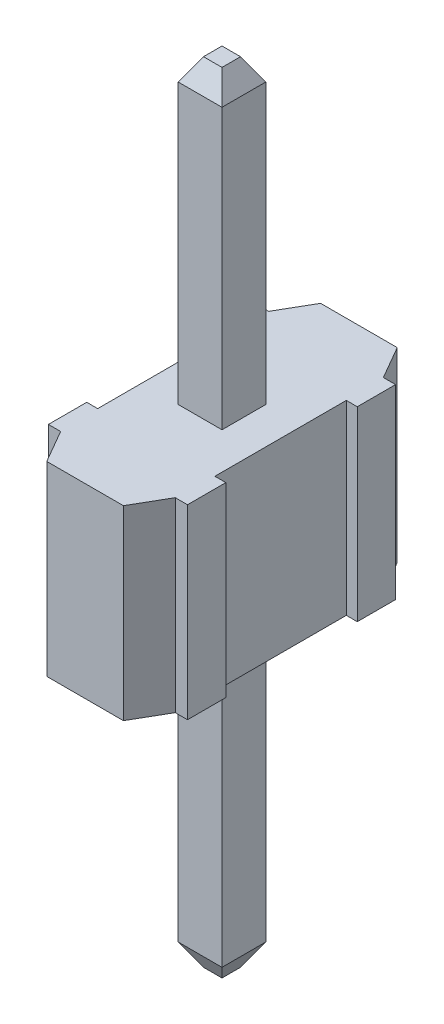
ISO-10303-21;
HEADER;
FILE_DESCRIPTION(('STEP AP214'),'2;1');
FILE_NAME('part.step','',(''),(''),'','','');
FILE_SCHEMA(('AUTOMOTIVE_DESIGN { 1 0 10303 214 1 1 1 1 }'));
ENDSEC;
DATA;
#1=APPLICATION_CONTEXT('core data for automotive mechanical design processes');
#2=APPLICATION_PROTOCOL_DEFINITION('international standard','automotive_design',2000,#1);
#3=PRODUCT_CONTEXT('',#1,'mechanical');
#4=PRODUCT('Part','Part','',(#3));
#5=PRODUCT_RELATED_PRODUCT_CATEGORY('part','',(#4));
#6=PRODUCT_DEFINITION_FORMATION('','',#4);
#7=PRODUCT_DEFINITION_CONTEXT('part definition',#1,'design');
#8=PRODUCT_DEFINITION('design','',#6,#7);
#9=PRODUCT_DEFINITION_SHAPE('','',#8);
#10=(LENGTH_UNIT() NAMED_UNIT(*) SI_UNIT(.MILLI.,.METRE.));
#11=(NAMED_UNIT(*) PLANE_ANGLE_UNIT() SI_UNIT($,.RADIAN.));
#12=(NAMED_UNIT(*) SI_UNIT($,.STERADIAN.) SOLID_ANGLE_UNIT());
#13=UNCERTAINTY_MEASURE_WITH_UNIT(LENGTH_MEASURE(1.E-05),#10,'distance_accuracy_value','');
#14=(GEOMETRIC_REPRESENTATION_CONTEXT(3) GLOBAL_UNCERTAINTY_ASSIGNED_CONTEXT((#13)) GLOBAL_UNIT_ASSIGNED_CONTEXT((#10,
#11,#12)) REPRESENTATION_CONTEXT('',''));
#15=CARTESIAN_POINT('',(0.,0.,0.));
#16=DIRECTION('',(0.,0.,1.));
#17=DIRECTION('',(1.,0.,0.));
#18=AXIS2_PLACEMENT_3D('',#15,#16,#17);
#19=CARTESIAN_POINT('',(0.,0.85,0.));
#20=DIRECTION('',(0.,-1.,0.));
#21=DIRECTION('',(0.,0.,-1.));
#22=AXIS2_PLACEMENT_3D('',#19,#20,#21);
#23=PLANE('',#22);
#24=DIRECTION('',(0.,0.,1.));
#25=VECTOR('',#24,1.);
#26=CARTESIAN_POINT('',(-0.635,0.85,0.95));
#27=LINE('',#26,#25);
#28=CARTESIAN_POINT('',(-0.635,0.85,0.6));
#29=VERTEX_POINT('',#28);
#30=CARTESIAN_POINT('',(-0.635,0.85,0.95));
#31=VERTEX_POINT('',#30);
#32=EDGE_CURVE('E282',#29,#31,#27,.T.);
#33=ORIENTED_EDGE('',*,*,#32,.T.);
#34=DIRECTION('',(1.,0.,0.));
#35=VECTOR('',#34,1.);
#36=CARTESIAN_POINT('',(-0.635,0.85,0.95));
#37=LINE('',#36,#35);
#38=CARTESIAN_POINT('',(-0.523205080756887,0.85,0.95));
#39=VERTEX_POINT('',#38);
#40=EDGE_CURVE('E285',#31,#39,#37,.T.);
#41=ORIENTED_EDGE('',*,*,#40,.T.);
#42=DIRECTION('',(0.499999999999998,0.,0.86602540378444));
#43=VECTOR('',#42,1.);
#44=CARTESIAN_POINT('',(-0.523205080756887,0.85,0.95));
#45=LINE('',#44,#43);
#46=CARTESIAN_POINT('',(-0.35,0.85,1.25));
#47=VERTEX_POINT('',#46);
#48=EDGE_CURVE('E288',#39,#47,#45,.T.);
#49=ORIENTED_EDGE('',*,*,#48,.T.);
#50=DIRECTION('',(1.,0.,0.));
#51=VECTOR('',#50,1.);
#52=CARTESIAN_POINT('',(-0.35,0.85,1.25));
#53=LINE('',#52,#51);
#54=CARTESIAN_POINT('',(0.35,0.85,1.25));
#55=VERTEX_POINT('',#54);
#56=EDGE_CURVE('E290',#47,#55,#53,.T.);
#57=ORIENTED_EDGE('',*,*,#56,.T.);
#58=DIRECTION('',(0.499999999999998,0.,-0.866025403784439));
#59=VECTOR('',#58,1.);
#60=CARTESIAN_POINT('',(0.523205080756887,0.85,0.95));
#61=LINE('',#60,#59);
#62=CARTESIAN_POINT('',(0.523205080756887,0.85,0.95));
#63=VERTEX_POINT('',#62);
#64=EDGE_CURVE('E292',#55,#63,#61,.T.);
#65=ORIENTED_EDGE('',*,*,#64,.T.);
#66=DIRECTION('',(1.,0.,0.));
#67=VECTOR('',#66,1.);
#68=CARTESIAN_POINT('',(0.635,0.85,0.95));
#69=LINE('',#68,#67);
#70=CARTESIAN_POINT('',(0.635,0.85,0.95));
#71=VERTEX_POINT('',#70);
#72=EDGE_CURVE('E294',#63,#71,#69,.T.);
#73=ORIENTED_EDGE('',*,*,#72,.T.);
#74=DIRECTION('',(0.,0.,-1.));
#75=VECTOR('',#74,1.);
#76=CARTESIAN_POINT('',(0.635,0.85,0.95));
#77=LINE('',#76,#75);
#78=CARTESIAN_POINT('',(0.635,0.85,0.6));
#79=VERTEX_POINT('',#78);
#80=EDGE_CURVE('E296',#71,#79,#77,.T.);
#81=ORIENTED_EDGE('',*,*,#80,.T.);
#82=DIRECTION('',(-1.,0.,0.));
#83=VECTOR('',#82,1.);
#84=CARTESIAN_POINT('',(0.635,0.85,0.6));
#85=LINE('',#84,#83);
#86=CARTESIAN_POINT('',(0.535,0.85,0.6));
#87=VERTEX_POINT('',#86);
#88=EDGE_CURVE('E298',#79,#87,#85,.T.);
#89=ORIENTED_EDGE('',*,*,#88,.T.);
#90=DIRECTION('',(0.,0.,-1.));
#91=VECTOR('',#90,1.);
#92=CARTESIAN_POINT('',(0.535,0.85,0.6));
#93=LINE('',#92,#91);
#94=CARTESIAN_POINT('',(0.535000000000001,0.85,-0.599999999999999));
#95=VERTEX_POINT('',#94);
#96=EDGE_CURVE('E300',#87,#95,#93,.T.);
#97=ORIENTED_EDGE('',*,*,#96,.T.);
#98=DIRECTION('',(1.,0.,0.));
#99=VECTOR('',#98,1.);
#100=CARTESIAN_POINT('',(0.635000000000001,0.85,-0.599999999999999));
#101=LINE('',#100,#99);
#102=CARTESIAN_POINT('',(0.635000000000001,0.85,-0.599999999999999));
#103=VERTEX_POINT('',#102);
#104=EDGE_CURVE('E302',#95,#103,#101,.T.);
#105=ORIENTED_EDGE('',*,*,#104,.T.);
#106=DIRECTION('',(0.,0.,-1.));
#107=VECTOR('',#106,1.);
#108=CARTESIAN_POINT('',(0.635000000000002,0.85,-0.949999999999999));
#109=LINE('',#108,#107);
#110=CARTESIAN_POINT('',(0.635000000000002,0.85,-0.949999999999999));
#111=VERTEX_POINT('',#110);
#112=EDGE_CURVE('E304',#103,#111,#109,.T.);
#113=ORIENTED_EDGE('',*,*,#112,.T.);
#114=DIRECTION('',(-1.,0.,0.));
#115=VECTOR('',#114,1.);
#116=CARTESIAN_POINT('',(0.635000000000002,0.85,-0.949999999999999));
#117=LINE('',#116,#115);
#118=CARTESIAN_POINT('',(0.523205080756888,0.85,-0.949999999999999));
#119=VERTEX_POINT('',#118);
#120=EDGE_CURVE('E306',#111,#119,#117,.T.);
#121=ORIENTED_EDGE('',*,*,#120,.T.);
#122=DIRECTION('',(-0.499999999999998,0.,-0.86602540378444));
#123=VECTOR('',#122,1.);
#124=CARTESIAN_POINT('',(0.523205080756888,0.85,-0.949999999999999));
#125=LINE('',#124,#123);
#126=CARTESIAN_POINT('',(0.350000000000002,0.85,-1.25));
#127=VERTEX_POINT('',#126);
#128=EDGE_CURVE('E308',#119,#127,#125,.T.);
#129=ORIENTED_EDGE('',*,*,#128,.T.);
#130=DIRECTION('',(-1.,0.,0.));
#131=VECTOR('',#130,1.);
#132=CARTESIAN_POINT('',(-0.350000000000002,0.85,-1.25));
#133=LINE('',#132,#131);
#134=CARTESIAN_POINT('',(-0.350000000000002,0.85,-1.25));
#135=VERTEX_POINT('',#134);
#136=EDGE_CURVE('E310',#127,#135,#133,.T.);
#137=ORIENTED_EDGE('',*,*,#136,.T.);
#138=DIRECTION('',(-0.499999999999997,0.,0.86602540378444));
#139=VECTOR('',#138,1.);
#140=CARTESIAN_POINT('',(-0.523205080756888,0.85,-0.95));
#141=LINE('',#140,#139);
#142=CARTESIAN_POINT('',(-0.523205080756888,0.85,-0.95));
#143=VERTEX_POINT('',#142);
#144=EDGE_CURVE('E312',#135,#143,#141,.T.);
#145=ORIENTED_EDGE('',*,*,#144,.T.);
#146=DIRECTION('',(-1.,0.,0.));
#147=VECTOR('',#146,1.);
#148=CARTESIAN_POINT('',(-0.635000000000001,0.85,-0.949999999999999));
#149=LINE('',#148,#147);
#150=CARTESIAN_POINT('',(-0.635000000000001,0.85,-0.949999999999999));
#151=VERTEX_POINT('',#150);
#152=EDGE_CURVE('E314',#143,#151,#149,.T.);
#153=ORIENTED_EDGE('',*,*,#152,.T.);
#154=DIRECTION('',(0.,0.,1.));
#155=VECTOR('',#154,1.);
#156=CARTESIAN_POINT('',(-0.635000000000001,0.85,-0.949999999999999));
#157=LINE('',#156,#155);
#158=CARTESIAN_POINT('',(-0.635000000000001,0.85,-0.599999999999999));
#159=VERTEX_POINT('',#158);
#160=EDGE_CURVE('E316',#151,#159,#157,.T.);
#161=ORIENTED_EDGE('',*,*,#160,.T.);
#162=DIRECTION('',(1.,0.,0.));
#163=VECTOR('',#162,1.);
#164=CARTESIAN_POINT('',(-0.635000000000001,0.85,-0.599999999999999));
#165=LINE('',#164,#163);
#166=CARTESIAN_POINT('',(-0.535000000000001,0.85,-0.599999999999999));
#167=VERTEX_POINT('',#166);
#168=EDGE_CURVE('E318',#159,#167,#165,.T.);
#169=ORIENTED_EDGE('',*,*,#168,.T.);
#170=DIRECTION('',(0.,0.,1.));
#171=VECTOR('',#170,1.);
#172=CARTESIAN_POINT('',(-0.535,0.85,0.6));
#173=LINE('',#172,#171);
#174=CARTESIAN_POINT('',(-0.535,0.85,0.6));
#175=VERTEX_POINT('',#174);
#176=EDGE_CURVE('E320',#167,#175,#173,.T.);
#177=ORIENTED_EDGE('',*,*,#176,.T.);
#178=DIRECTION('',(-1.,0.,0.));
#179=VECTOR('',#178,1.);
#180=CARTESIAN_POINT('',(-0.635,0.85,0.6));
#181=LINE('',#180,#179);
#182=EDGE_CURVE('E322',#175,#29,#181,.T.);
#183=ORIENTED_EDGE('',*,*,#182,.T.);
#184=EDGE_LOOP('',(#33,#41,#49,#57,#65,#73,#81,#89,#97,#105,#113,#121,#129,#137,#145,#153,#161,
#169,#177,#183));
#185=FACE_BOUND('',#184,.T.);
#186=DIRECTION('',(0.,0.,1.));
#187=VECTOR('',#186,1.);
#188=CARTESIAN_POINT('',(-0.199999999999998,0.85,0.));
#189=LINE('',#188,#187);
#190=CARTESIAN_POINT('',(-0.199999999999998,0.85,-0.2));
#191=VERTEX_POINT('',#190);
#192=CARTESIAN_POINT('',(-0.199999999999998,0.85,0.2));
#193=VERTEX_POINT('',#192);
#194=EDGE_CURVE('E250',#191,#193,#189,.T.);
#195=ORIENTED_EDGE('',*,*,#194,.F.);
#196=DIRECTION('',(-1.,0.,0.));
#197=VECTOR('',#196,1.);
#198=CARTESIAN_POINT('',(0.,0.85,-0.2));
#199=LINE('',#198,#197);
#200=CARTESIAN_POINT('',(0.199999999999998,0.85,-0.2));
#201=VERTEX_POINT('',#200);
#202=EDGE_CURVE('E264',#201,#191,#199,.T.);
#203=ORIENTED_EDGE('',*,*,#202,.F.);
#204=DIRECTION('',(0.,0.,-1.));
#205=VECTOR('',#204,1.);
#206=CARTESIAN_POINT('',(0.199999999999998,0.85,0.));
#207=LINE('',#206,#205);
#208=CARTESIAN_POINT('',(0.199999999999998,0.85,0.2));
#209=VERTEX_POINT('',#208);
#210=EDGE_CURVE('E273',#209,#201,#207,.T.);
#211=ORIENTED_EDGE('',*,*,#210,.F.);
#212=DIRECTION('',(1.,0.,0.));
#213=VECTOR('',#212,1.);
#214=CARTESIAN_POINT('',(0.,0.85,0.2));
#215=LINE('',#214,#213);
#216=EDGE_CURVE('E267',#193,#209,#215,.T.);
#217=ORIENTED_EDGE('',*,*,#216,.F.);
#218=EDGE_LOOP('',(#195,#203,#211,#217));
#219=FACE_BOUND('',#218,.T.);
#220=ADVANCED_FACE('F35',(#185,#219),#23,.F.);
#221=CARTESIAN_POINT('',(0.,-0.85,0.));
#222=DIRECTION('',(0.,-1.,0.));
#223=DIRECTION('',(0.,0.,-1.));
#224=AXIS2_PLACEMENT_3D('',#221,#222,#223);
#225=PLANE('',#224);
#226=DIRECTION('',(0.,0.,1.));
#227=VECTOR('',#226,1.);
#228=CARTESIAN_POINT('',(-0.635,-0.85,0.95));
#229=LINE('',#228,#227);
#230=CARTESIAN_POINT('',(-0.635,-0.85,0.6));
#231=VERTEX_POINT('',#230);
#232=CARTESIAN_POINT('',(-0.635,-0.85,0.95));
#233=VERTEX_POINT('',#232);
#234=EDGE_CURVE('E268',#231,#233,#229,.T.);
#235=ORIENTED_EDGE('',*,*,#234,.F.);
#236=DIRECTION('',(-1.,0.,0.));
#237=VECTOR('',#236,1.);
#238=CARTESIAN_POINT('',(-0.635,-0.85,0.6));
#239=LINE('',#238,#237);
#240=CARTESIAN_POINT('',(-0.535,-0.85,0.6));
#241=VERTEX_POINT('',#240);
#242=EDGE_CURVE('E286',#241,#231,#239,.T.);
#243=ORIENTED_EDGE('',*,*,#242,.F.);
#244=DIRECTION('',(0.,0.,1.));
#245=VECTOR('',#244,1.);
#246=CARTESIAN_POINT('',(-0.535,-0.85,0.6));
#247=LINE('',#246,#245);
#248=CARTESIAN_POINT('',(-0.535000000000001,-0.85,-0.599999999999999));
#249=VERTEX_POINT('',#248);
#250=EDGE_CURVE('E361',#249,#241,#247,.T.);
#251=ORIENTED_EDGE('',*,*,#250,.F.);
#252=DIRECTION('',(1.,0.,0.));
#253=VECTOR('',#252,1.);
#254=CARTESIAN_POINT('',(-0.635000000000001,-0.85,-0.599999999999999));
#255=LINE('',#254,#253);
#256=CARTESIAN_POINT('',(-0.635000000000001,-0.85,-0.599999999999999));
#257=VERTEX_POINT('',#256);
#258=EDGE_CURVE('E359',#257,#249,#255,.T.);
#259=ORIENTED_EDGE('',*,*,#258,.F.);
#260=DIRECTION('',(0.,0.,1.));
#261=VECTOR('',#260,1.);
#262=CARTESIAN_POINT('',(-0.635000000000001,-0.85,-0.949999999999999));
#263=LINE('',#262,#261);
#264=CARTESIAN_POINT('',(-0.635000000000001,-0.85,-0.949999999999999));
#265=VERTEX_POINT('',#264);
#266=EDGE_CURVE('E357',#265,#257,#263,.T.);
#267=ORIENTED_EDGE('',*,*,#266,.F.);
#268=DIRECTION('',(-1.,0.,0.));
#269=VECTOR('',#268,1.);
#270=CARTESIAN_POINT('',(-0.635000000000001,-0.85,-0.949999999999999));
#271=LINE('',#270,#269);
#272=CARTESIAN_POINT('',(-0.523205080756888,-0.85,-0.95));
#273=VERTEX_POINT('',#272);
#274=EDGE_CURVE('E355',#273,#265,#271,.T.);
#275=ORIENTED_EDGE('',*,*,#274,.F.);
#276=DIRECTION('',(-0.499999999999997,0.,0.86602540378444));
#277=VECTOR('',#276,1.);
#278=CARTESIAN_POINT('',(-0.523205080756888,-0.85,-0.95));
#279=LINE('',#278,#277);
#280=CARTESIAN_POINT('',(-0.350000000000002,-0.85,-1.25));
#281=VERTEX_POINT('',#280);
#282=EDGE_CURVE('E353',#281,#273,#279,.T.);
#283=ORIENTED_EDGE('',*,*,#282,.F.);
#284=DIRECTION('',(-1.,0.,0.));
#285=VECTOR('',#284,1.);
#286=CARTESIAN_POINT('',(-0.350000000000002,-0.85,-1.25));
#287=LINE('',#286,#285);
#288=CARTESIAN_POINT('',(0.350000000000002,-0.85,-1.25));
#289=VERTEX_POINT('',#288);
#290=EDGE_CURVE('E351',#289,#281,#287,.T.);
#291=ORIENTED_EDGE('',*,*,#290,.F.);
#292=DIRECTION('',(-0.499999999999998,0.,-0.86602540378444));
#293=VECTOR('',#292,1.);
#294=CARTESIAN_POINT('',(0.523205080756888,-0.85,-0.949999999999999));
#295=LINE('',#294,#293);
#296=CARTESIAN_POINT('',(0.523205080756888,-0.85,-0.949999999999999));
#297=VERTEX_POINT('',#296);
#298=EDGE_CURVE('E349',#297,#289,#295,.T.);
#299=ORIENTED_EDGE('',*,*,#298,.F.);
#300=DIRECTION('',(-1.,0.,0.));
#301=VECTOR('',#300,1.);
#302=CARTESIAN_POINT('',(0.635000000000002,-0.85,-0.949999999999999));
#303=LINE('',#302,#301);
#304=CARTESIAN_POINT('',(0.635000000000002,-0.85,-0.949999999999999));
#305=VERTEX_POINT('',#304);
#306=EDGE_CURVE('E347',#305,#297,#303,.T.);
#307=ORIENTED_EDGE('',*,*,#306,.F.);
#308=DIRECTION('',(0.,0.,-1.));
#309=VECTOR('',#308,1.);
#310=CARTESIAN_POINT('',(0.635000000000002,-0.85,-0.949999999999999));
#311=LINE('',#310,#309);
#312=CARTESIAN_POINT('',(0.635000000000001,-0.85,-0.599999999999999));
#313=VERTEX_POINT('',#312);
#314=EDGE_CURVE('E345',#313,#305,#311,.T.);
#315=ORIENTED_EDGE('',*,*,#314,.F.);
#316=DIRECTION('',(1.,0.,0.));
#317=VECTOR('',#316,1.);
#318=CARTESIAN_POINT('',(0.635000000000001,-0.85,-0.599999999999999));
#319=LINE('',#318,#317);
#320=CARTESIAN_POINT('',(0.535000000000001,-0.85,-0.599999999999999));
#321=VERTEX_POINT('',#320);
#322=EDGE_CURVE('E343',#321,#313,#319,.T.);
#323=ORIENTED_EDGE('',*,*,#322,.F.);
#324=DIRECTION('',(0.,0.,-1.));
#325=VECTOR('',#324,1.);
#326=CARTESIAN_POINT('',(0.535,-0.85,0.6));
#327=LINE('',#326,#325);
#328=CARTESIAN_POINT('',(0.535,-0.85,0.6));
#329=VERTEX_POINT('',#328);
#330=EDGE_CURVE('E341',#329,#321,#327,.T.);
#331=ORIENTED_EDGE('',*,*,#330,.F.);
#332=DIRECTION('',(-1.,0.,0.));
#333=VECTOR('',#332,1.);
#334=CARTESIAN_POINT('',(0.635,-0.85,0.6));
#335=LINE('',#334,#333);
#336=CARTESIAN_POINT('',(0.635,-0.85,0.6));
#337=VERTEX_POINT('',#336);
#338=EDGE_CURVE('E339',#337,#329,#335,.T.);
#339=ORIENTED_EDGE('',*,*,#338,.F.);
#340=DIRECTION('',(0.,0.,-1.));
#341=VECTOR('',#340,1.);
#342=CARTESIAN_POINT('',(0.635,-0.85,0.95));
#343=LINE('',#342,#341);
#344=CARTESIAN_POINT('',(0.635,-0.85,0.95));
#345=VERTEX_POINT('',#344);
#346=EDGE_CURVE('E337',#345,#337,#343,.T.);
#347=ORIENTED_EDGE('',*,*,#346,.F.);
#348=DIRECTION('',(1.,0.,0.));
#349=VECTOR('',#348,1.);
#350=CARTESIAN_POINT('',(0.635,-0.85,0.95));
#351=LINE('',#350,#349);
#352=CARTESIAN_POINT('',(0.523205080756887,-0.85,0.95));
#353=VERTEX_POINT('',#352);
#354=EDGE_CURVE('E335',#353,#345,#351,.T.);
#355=ORIENTED_EDGE('',*,*,#354,.F.);
#356=DIRECTION('',(0.499999999999998,0.,-0.866025403784439));
#357=VECTOR('',#356,1.);
#358=CARTESIAN_POINT('',(0.523205080756887,-0.85,0.95));
#359=LINE('',#358,#357);
#360=CARTESIAN_POINT('',(0.35,-0.85,1.25));
#361=VERTEX_POINT('',#360);
#362=EDGE_CURVE('E333',#361,#353,#359,.T.);
#363=ORIENTED_EDGE('',*,*,#362,.F.);
#364=DIRECTION('',(1.,0.,0.));
#365=VECTOR('',#364,1.);
#366=CARTESIAN_POINT('',(-0.35,-0.85,1.25));
#367=LINE('',#366,#365);
#368=CARTESIAN_POINT('',(-0.35,-0.85,1.25));
#369=VERTEX_POINT('',#368);
#370=EDGE_CURVE('E331',#369,#361,#367,.T.);
#371=ORIENTED_EDGE('',*,*,#370,.F.);
#372=DIRECTION('',(0.499999999999998,0.,0.86602540378444));
#373=VECTOR('',#372,1.);
#374=CARTESIAN_POINT('',(-0.523205080756887,-0.85,0.95));
#375=LINE('',#374,#373);
#376=CARTESIAN_POINT('',(-0.523205080756887,-0.85,0.95));
#377=VERTEX_POINT('',#376);
#378=EDGE_CURVE('E329',#377,#369,#375,.T.);
#379=ORIENTED_EDGE('',*,*,#378,.F.);
#380=DIRECTION('',(1.,0.,0.));
#381=VECTOR('',#380,1.);
#382=CARTESIAN_POINT('',(-0.635,-0.85,0.95));
#383=LINE('',#382,#381);
#384=EDGE_CURVE('E327',#233,#377,#383,.T.);
#385=ORIENTED_EDGE('',*,*,#384,.F.);
#386=EDGE_LOOP('',(#235,#243,#251,#259,#267,#275,#283,#291,#299,#307,#315,#323,#331,#339,#347,
#355,#363,#371,#379,#385));
#387=FACE_BOUND('',#386,.T.);
#388=DIRECTION('',(-1.,0.,0.));
#389=VECTOR('',#388,1.);
#390=CARTESIAN_POINT('',(0.,-0.85,-0.2));
#391=LINE('',#390,#389);
#392=CARTESIAN_POINT('',(0.199999999999998,-0.85,-0.2));
#393=VERTEX_POINT('',#392);
#394=CARTESIAN_POINT('',(-0.199999999999998,-0.85,-0.2));
#395=VERTEX_POINT('',#394);
#396=EDGE_CURVE('E423',#393,#395,#391,.T.);
#397=ORIENTED_EDGE('',*,*,#396,.T.);
#398=DIRECTION('',(0.,0.,1.));
#399=VECTOR('',#398,1.);
#400=CARTESIAN_POINT('',(-0.199999999999998,-0.85,0.));
#401=LINE('',#400,#399);
#402=CARTESIAN_POINT('',(-0.199999999999998,-0.85,0.2));
#403=VERTEX_POINT('',#402);
#404=EDGE_CURVE('E432',#395,#403,#401,.T.);
#405=ORIENTED_EDGE('',*,*,#404,.T.);
#406=DIRECTION('',(1.,0.,0.));
#407=VECTOR('',#406,1.);
#408=CARTESIAN_POINT('',(0.,-0.85,0.2));
#409=LINE('',#408,#407);
#410=CARTESIAN_POINT('',(0.199999999999998,-0.85,0.2));
#411=VERTEX_POINT('',#410);
#412=EDGE_CURVE('E429',#403,#411,#409,.T.);
#413=ORIENTED_EDGE('',*,*,#412,.T.);
#414=DIRECTION('',(0.,0.,-1.));
#415=VECTOR('',#414,1.);
#416=CARTESIAN_POINT('',(0.199999999999998,-0.85,0.));
#417=LINE('',#416,#415);
#418=EDGE_CURVE('E426',#411,#393,#417,.T.);
#419=ORIENTED_EDGE('',*,*,#418,.T.);
#420=EDGE_LOOP('',(#397,#405,#413,#419));
#421=FACE_BOUND('',#420,.T.);
#422=ADVANCED_FACE('F511',(#387,#421),#225,.T.);
#423=CARTESIAN_POINT('',(-0.635,0.85,0.95));
#424=DIRECTION('',(1.,0.,0.));
#425=DIRECTION('',(0.,0.,-1.));
#426=AXIS2_PLACEMENT_3D('',#423,#424,#425);
#427=PLANE('',#426);
#428=ORIENTED_EDGE('',*,*,#234,.T.);
#429=DIRECTION('',(0.,-1.,0.));
#430=VECTOR('',#429,1.);
#431=CARTESIAN_POINT('',(-0.635,0.85,0.95));
#432=LINE('',#431,#430);
#433=EDGE_CURVE('E420',#31,#233,#432,.T.);
#434=ORIENTED_EDGE('',*,*,#433,.F.);
#435=ORIENTED_EDGE('',*,*,#32,.F.);
#436=DIRECTION('',(0.,-1.,0.));
#437=VECTOR('',#436,1.);
#438=CARTESIAN_POINT('',(-0.635,0.85,0.6));
#439=LINE('',#438,#437);
#440=EDGE_CURVE('E324',#29,#231,#439,.T.);
#441=ORIENTED_EDGE('',*,*,#440,.T.);
#442=EDGE_LOOP('',(#428,#434,#435,#441));
#443=FACE_BOUND('',#442,.T.);
#444=ADVANCED_FACE('F529',(#443),#427,.F.);
#445=CARTESIAN_POINT('',(-0.635,0.85,0.95));
#446=DIRECTION('',(0.,0.,-1.));
#447=DIRECTION('',(-1.,0.,0.));
#448=AXIS2_PLACEMENT_3D('',#445,#446,#447);
#449=PLANE('',#448);
#450=ORIENTED_EDGE('',*,*,#384,.T.);
#451=DIRECTION('',(0.,-1.,0.));
#452=VECTOR('',#451,1.);
#453=CARTESIAN_POINT('',(-0.523205080756887,0.85,0.95));
#454=LINE('',#453,#452);
#455=EDGE_CURVE('E417',#39,#377,#454,.T.);
#456=ORIENTED_EDGE('',*,*,#455,.F.);
#457=ORIENTED_EDGE('',*,*,#40,.F.);
#458=ORIENTED_EDGE('',*,*,#433,.T.);
#459=EDGE_LOOP('',(#450,#456,#457,#458));
#460=FACE_BOUND('',#459,.T.);
#461=ADVANCED_FACE('F604',(#460),#449,.F.);
#462=CARTESIAN_POINT('',(-0.523205080756887,0.85,0.95));
#463=DIRECTION('',(0.86602540378444,0.,-0.499999999999998));
#464=DIRECTION('',(-0.499999999999998,0.,-0.86602540378444));
#465=AXIS2_PLACEMENT_3D('',#462,#463,#464);
#466=PLANE('',#465);
#467=ORIENTED_EDGE('',*,*,#378,.T.);
#468=DIRECTION('',(0.,-1.,0.));
#469=VECTOR('',#468,1.);
#470=CARTESIAN_POINT('',(-0.35,0.85,1.25));
#471=LINE('',#470,#469);
#472=EDGE_CURVE('E414',#47,#369,#471,.T.);
#473=ORIENTED_EDGE('',*,*,#472,.F.);
#474=ORIENTED_EDGE('',*,*,#48,.F.);
#475=ORIENTED_EDGE('',*,*,#455,.T.);
#476=EDGE_LOOP('',(#467,#473,#474,#475));
#477=FACE_BOUND('',#476,.T.);
#478=ADVANCED_FACE('F600',(#477),#466,.F.);
#479=CARTESIAN_POINT('',(-0.35,0.85,1.25));
#480=DIRECTION('',(0.,0.,-1.));
#481=DIRECTION('',(-1.,0.,0.));
#482=AXIS2_PLACEMENT_3D('',#479,#480,#481);
#483=PLANE('',#482);
#484=ORIENTED_EDGE('',*,*,#370,.T.);
#485=DIRECTION('',(0.,-1.,0.));
#486=VECTOR('',#485,1.);
#487=CARTESIAN_POINT('',(0.35,0.85,1.25));
#488=LINE('',#487,#486);
#489=EDGE_CURVE('E411',#55,#361,#488,.T.);
#490=ORIENTED_EDGE('',*,*,#489,.F.);
#491=ORIENTED_EDGE('',*,*,#56,.F.);
#492=ORIENTED_EDGE('',*,*,#472,.T.);
#493=EDGE_LOOP('',(#484,#490,#491,#492));
#494=FACE_BOUND('',#493,.T.);
#495=ADVANCED_FACE('F596',(#494),#483,.F.);
#496=CARTESIAN_POINT('',(0.523205080756887,0.85,0.95));
#497=DIRECTION('',(-0.866025403784439,0.,-0.499999999999998));
#498=DIRECTION('',(-0.499999999999999,0.,0.86602540378444));
#499=AXIS2_PLACEMENT_3D('',#496,#497,#498);
#500=PLANE('',#499);
#501=ORIENTED_EDGE('',*,*,#362,.T.);
#502=DIRECTION('',(0.,-1.,0.));
#503=VECTOR('',#502,1.);
#504=CARTESIAN_POINT('',(0.523205080756887,0.85,0.95));
#505=LINE('',#504,#503);
#506=EDGE_CURVE('E408',#63,#353,#505,.T.);
#507=ORIENTED_EDGE('',*,*,#506,.F.);
#508=ORIENTED_EDGE('',*,*,#64,.F.);
#509=ORIENTED_EDGE('',*,*,#489,.T.);
#510=EDGE_LOOP('',(#501,#507,#508,#509));
#511=FACE_BOUND('',#510,.T.);
#512=ADVANCED_FACE('F592',(#511),#500,.F.);
#513=CARTESIAN_POINT('',(0.635,0.85,0.95));
#514=DIRECTION('',(0.,0.,-1.));
#515=DIRECTION('',(-1.,0.,0.));
#516=AXIS2_PLACEMENT_3D('',#513,#514,#515);
#517=PLANE('',#516);
#518=ORIENTED_EDGE('',*,*,#354,.T.);
#519=DIRECTION('',(0.,-1.,0.));
#520=VECTOR('',#519,1.);
#521=CARTESIAN_POINT('',(0.635,0.85,0.95));
#522=LINE('',#521,#520);
#523=EDGE_CURVE('E405',#71,#345,#522,.T.);
#524=ORIENTED_EDGE('',*,*,#523,.F.);
#525=ORIENTED_EDGE('',*,*,#72,.F.);
#526=ORIENTED_EDGE('',*,*,#506,.T.);
#527=EDGE_LOOP('',(#518,#524,#525,#526));
#528=FACE_BOUND('',#527,.T.);
#529=ADVANCED_FACE('F588',(#528),#517,.F.);
#530=CARTESIAN_POINT('',(0.635,0.85,0.95));
#531=DIRECTION('',(-1.,0.,0.));
#532=DIRECTION('',(0.,0.,1.));
#533=AXIS2_PLACEMENT_3D('',#530,#531,#532);
#534=PLANE('',#533);
#535=ORIENTED_EDGE('',*,*,#346,.T.);
#536=DIRECTION('',(0.,-1.,0.));
#537=VECTOR('',#536,1.);
#538=CARTESIAN_POINT('',(0.635,0.85,0.6));
#539=LINE('',#538,#537);
#540=EDGE_CURVE('E402',#79,#337,#539,.T.);
#541=ORIENTED_EDGE('',*,*,#540,.F.);
#542=ORIENTED_EDGE('',*,*,#80,.F.);
#543=ORIENTED_EDGE('',*,*,#523,.T.);
#544=EDGE_LOOP('',(#535,#541,#542,#543));
#545=FACE_BOUND('',#544,.T.);
#546=ADVANCED_FACE('F584',(#545),#534,.F.);
#547=CARTESIAN_POINT('',(0.635,0.85,0.6));
#548=DIRECTION('',(0.,0.,1.));
#549=DIRECTION('',(1.,0.,0.));
#550=AXIS2_PLACEMENT_3D('',#547,#548,#549);
#551=PLANE('',#550);
#552=ORIENTED_EDGE('',*,*,#338,.T.);
#553=DIRECTION('',(0.,-1.,0.));
#554=VECTOR('',#553,1.);
#555=CARTESIAN_POINT('',(0.535,0.85,0.6));
#556=LINE('',#555,#554);
#557=EDGE_CURVE('E399',#87,#329,#556,.T.);
#558=ORIENTED_EDGE('',*,*,#557,.F.);
#559=ORIENTED_EDGE('',*,*,#88,.F.);
#560=ORIENTED_EDGE('',*,*,#540,.T.);
#561=EDGE_LOOP('',(#552,#558,#559,#560));
#562=FACE_BOUND('',#561,.T.);
#563=ADVANCED_FACE('F580',(#562),#551,.F.);
#564=CARTESIAN_POINT('',(0.535,0.85,0.6));
#565=DIRECTION('',(-1.,0.,0.));
#566=DIRECTION('',(0.,0.,1.));
#567=AXIS2_PLACEMENT_3D('',#564,#565,#566);
#568=PLANE('',#567);
#569=ORIENTED_EDGE('',*,*,#330,.T.);
#570=DIRECTION('',(0.,-1.,0.));
#571=VECTOR('',#570,1.);
#572=CARTESIAN_POINT('',(0.535000000000001,0.85,-0.599999999999999));
#573=LINE('',#572,#571);
#574=EDGE_CURVE('E396',#95,#321,#573,.T.);
#575=ORIENTED_EDGE('',*,*,#574,.F.);
#576=ORIENTED_EDGE('',*,*,#96,.F.);
#577=ORIENTED_EDGE('',*,*,#557,.T.);
#578=EDGE_LOOP('',(#569,#575,#576,#577));
#579=FACE_BOUND('',#578,.T.);
#580=ADVANCED_FACE('F576',(#579),#568,.F.);
#581=CARTESIAN_POINT('',(0.635000000000001,0.85,-0.599999999999999));
#582=DIRECTION('',(0.,0.,-1.));
#583=DIRECTION('',(-1.,0.,0.));
#584=AXIS2_PLACEMENT_3D('',#581,#582,#583);
#585=PLANE('',#584);
#586=ORIENTED_EDGE('',*,*,#322,.T.);
#587=DIRECTION('',(0.,-1.,0.));
#588=VECTOR('',#587,1.);
#589=CARTESIAN_POINT('',(0.635000000000001,0.85,-0.599999999999999));
#590=LINE('',#589,#588);
#591=EDGE_CURVE('E393',#103,#313,#590,.T.);
#592=ORIENTED_EDGE('',*,*,#591,.F.);
#593=ORIENTED_EDGE('',*,*,#104,.F.);
#594=ORIENTED_EDGE('',*,*,#574,.T.);
#595=EDGE_LOOP('',(#586,#592,#593,#594));
#596=FACE_BOUND('',#595,.T.);
#597=ADVANCED_FACE('F572',(#596),#585,.F.);
#598=CARTESIAN_POINT('',(0.635000000000002,0.85,-0.949999999999999));
#599=DIRECTION('',(-1.,0.,0.));
#600=DIRECTION('',(0.,0.,1.));
#601=AXIS2_PLACEMENT_3D('',#598,#599,#600);
#602=PLANE('',#601);
#603=ORIENTED_EDGE('',*,*,#314,.T.);
#604=DIRECTION('',(0.,-1.,0.));
#605=VECTOR('',#604,1.);
#606=CARTESIAN_POINT('',(0.635000000000002,0.85,-0.949999999999999));
#607=LINE('',#606,#605);
#608=EDGE_CURVE('E390',#111,#305,#607,.T.);
#609=ORIENTED_EDGE('',*,*,#608,.F.);
#610=ORIENTED_EDGE('',*,*,#112,.F.);
#611=ORIENTED_EDGE('',*,*,#591,.T.);
#612=EDGE_LOOP('',(#603,#609,#610,#611));
#613=FACE_BOUND('',#612,.T.);
#614=ADVANCED_FACE('F568',(#613),#602,.F.);
#615=CARTESIAN_POINT('',(0.635000000000002,0.85,-0.949999999999999));
#616=DIRECTION('',(0.,0.,1.));
#617=DIRECTION('',(1.,0.,0.));
#618=AXIS2_PLACEMENT_3D('',#615,#616,#617);
#619=PLANE('',#618);
#620=ORIENTED_EDGE('',*,*,#306,.T.);
#621=DIRECTION('',(0.,-1.,0.));
#622=VECTOR('',#621,1.);
#623=CARTESIAN_POINT('',(0.523205080756888,0.85,-0.949999999999999));
#624=LINE('',#623,#622);
#625=EDGE_CURVE('E387',#119,#297,#624,.T.);
#626=ORIENTED_EDGE('',*,*,#625,.F.);
#627=ORIENTED_EDGE('',*,*,#120,.F.);
#628=ORIENTED_EDGE('',*,*,#608,.T.);
#629=EDGE_LOOP('',(#620,#626,#627,#628));
#630=FACE_BOUND('',#629,.T.);
#631=ADVANCED_FACE('F564',(#630),#619,.F.);
#632=CARTESIAN_POINT('',(0.523205080756888,0.85,-0.949999999999999));
#633=DIRECTION('',(-0.86602540378444,0.,0.499999999999998));
#634=DIRECTION('',(0.499999999999998,0.,0.86602540378444));
#635=AXIS2_PLACEMENT_3D('',#632,#633,#634);
#636=PLANE('',#635);
#637=ORIENTED_EDGE('',*,*,#298,.T.);
#638=DIRECTION('',(0.,-1.,0.));
#639=VECTOR('',#638,1.);
#640=CARTESIAN_POINT('',(0.350000000000002,0.85,-1.25));
#641=LINE('',#640,#639);
#642=EDGE_CURVE('E384',#127,#289,#641,.T.);
#643=ORIENTED_EDGE('',*,*,#642,.F.);
#644=ORIENTED_EDGE('',*,*,#128,.F.);
#645=ORIENTED_EDGE('',*,*,#625,.T.);
#646=EDGE_LOOP('',(#637,#643,#644,#645));
#647=FACE_BOUND('',#646,.T.);
#648=ADVANCED_FACE('F560',(#647),#636,.F.);
#649=CARTESIAN_POINT('',(-0.350000000000002,0.85,-1.25));
#650=DIRECTION('',(0.,0.,1.));
#651=DIRECTION('',(1.,0.,0.));
#652=AXIS2_PLACEMENT_3D('',#649,#650,#651);
#653=PLANE('',#652);
#654=ORIENTED_EDGE('',*,*,#290,.T.);
#655=DIRECTION('',(0.,-1.,0.));
#656=VECTOR('',#655,1.);
#657=CARTESIAN_POINT('',(-0.350000000000002,0.85,-1.25));
#658=LINE('',#657,#656);
#659=EDGE_CURVE('E381',#135,#281,#658,.T.);
#660=ORIENTED_EDGE('',*,*,#659,.F.);
#661=ORIENTED_EDGE('',*,*,#136,.F.);
#662=ORIENTED_EDGE('',*,*,#642,.T.);
#663=EDGE_LOOP('',(#654,#660,#661,#662));
#664=FACE_BOUND('',#663,.T.);
#665=ADVANCED_FACE('F556',(#664),#653,.F.);
#666=CARTESIAN_POINT('',(-0.523205080756888,0.85,-0.95));
#667=DIRECTION('',(0.86602540378444,0.,0.499999999999997));
#668=DIRECTION('',(0.499999999999997,0.,-0.86602540378444));
#669=AXIS2_PLACEMENT_3D('',#666,#667,#668);
#670=PLANE('',#669);
#671=ORIENTED_EDGE('',*,*,#282,.T.);
#672=DIRECTION('',(0.,-1.,0.));
#673=VECTOR('',#672,1.);
#674=CARTESIAN_POINT('',(-0.523205080756888,0.85,-0.95));
#675=LINE('',#674,#673);
#676=EDGE_CURVE('E378',#143,#273,#675,.T.);
#677=ORIENTED_EDGE('',*,*,#676,.F.);
#678=ORIENTED_EDGE('',*,*,#144,.F.);
#679=ORIENTED_EDGE('',*,*,#659,.T.);
#680=EDGE_LOOP('',(#671,#677,#678,#679));
#681=FACE_BOUND('',#680,.T.);
#682=ADVANCED_FACE('F552',(#681),#670,.F.);
#683=CARTESIAN_POINT('',(-0.635000000000001,0.85,-0.949999999999999));
#684=DIRECTION('',(0.,0.,1.));
#685=DIRECTION('',(1.,0.,0.));
#686=AXIS2_PLACEMENT_3D('',#683,#684,#685);
#687=PLANE('',#686);
#688=ORIENTED_EDGE('',*,*,#274,.T.);
#689=DIRECTION('',(0.,-1.,0.));
#690=VECTOR('',#689,1.);
#691=CARTESIAN_POINT('',(-0.635000000000001,0.85,-0.949999999999999));
#692=LINE('',#691,#690);
#693=EDGE_CURVE('E375',#151,#265,#692,.T.);
#694=ORIENTED_EDGE('',*,*,#693,.F.);
#695=ORIENTED_EDGE('',*,*,#152,.F.);
#696=ORIENTED_EDGE('',*,*,#676,.T.);
#697=EDGE_LOOP('',(#688,#694,#695,#696));
#698=FACE_BOUND('',#697,.T.);
#699=ADVANCED_FACE('F548',(#698),#687,.F.);
#700=CARTESIAN_POINT('',(-0.635000000000001,0.85,-0.949999999999999));
#701=DIRECTION('',(1.,0.,0.));
#702=DIRECTION('',(0.,0.,-1.));
#703=AXIS2_PLACEMENT_3D('',#700,#701,#702);
#704=PLANE('',#703);
#705=ORIENTED_EDGE('',*,*,#266,.T.);
#706=DIRECTION('',(0.,-1.,0.));
#707=VECTOR('',#706,1.);
#708=CARTESIAN_POINT('',(-0.635000000000001,0.85,-0.599999999999999));
#709=LINE('',#708,#707);
#710=EDGE_CURVE('E372',#159,#257,#709,.T.);
#711=ORIENTED_EDGE('',*,*,#710,.F.);
#712=ORIENTED_EDGE('',*,*,#160,.F.);
#713=ORIENTED_EDGE('',*,*,#693,.T.);
#714=EDGE_LOOP('',(#705,#711,#712,#713));
#715=FACE_BOUND('',#714,.T.);
#716=ADVANCED_FACE('F544',(#715),#704,.F.);
#717=CARTESIAN_POINT('',(-0.635000000000001,0.85,-0.599999999999999));
#718=DIRECTION('',(0.,0.,-1.));
#719=DIRECTION('',(-1.,0.,0.));
#720=AXIS2_PLACEMENT_3D('',#717,#718,#719);
#721=PLANE('',#720);
#722=ORIENTED_EDGE('',*,*,#258,.T.);
#723=DIRECTION('',(0.,-1.,0.));
#724=VECTOR('',#723,1.);
#725=CARTESIAN_POINT('',(-0.535000000000001,0.85,-0.599999999999999));
#726=LINE('',#725,#724);
#727=EDGE_CURVE('E369',#167,#249,#726,.T.);
#728=ORIENTED_EDGE('',*,*,#727,.F.);
#729=ORIENTED_EDGE('',*,*,#168,.F.);
#730=ORIENTED_EDGE('',*,*,#710,.T.);
#731=EDGE_LOOP('',(#722,#728,#729,#730));
#732=FACE_BOUND('',#731,.T.);
#733=ADVANCED_FACE('F540',(#732),#721,.F.);
#734=CARTESIAN_POINT('',(-0.535,0.85,0.6));
#735=DIRECTION('',(1.,0.,0.));
#736=DIRECTION('',(0.,0.,-1.));
#737=AXIS2_PLACEMENT_3D('',#734,#735,#736);
#738=PLANE('',#737);
#739=ORIENTED_EDGE('',*,*,#250,.T.);
#740=DIRECTION('',(0.,-1.,0.));
#741=VECTOR('',#740,1.);
#742=CARTESIAN_POINT('',(-0.535,0.85,0.6));
#743=LINE('',#742,#741);
#744=EDGE_CURVE('E366',#175,#241,#743,.T.);
#745=ORIENTED_EDGE('',*,*,#744,.F.);
#746=ORIENTED_EDGE('',*,*,#176,.F.);
#747=ORIENTED_EDGE('',*,*,#727,.T.);
#748=EDGE_LOOP('',(#739,#745,#746,#747));
#749=FACE_BOUND('',#748,.T.);
#750=ADVANCED_FACE('F536',(#749),#738,.F.);
#751=CARTESIAN_POINT('',(-0.635,0.85,0.6));
#752=DIRECTION('',(0.,0.,1.));
#753=DIRECTION('',(1.,0.,0.));
#754=AXIS2_PLACEMENT_3D('',#751,#752,#753);
#755=PLANE('',#754);
#756=ORIENTED_EDGE('',*,*,#242,.T.);
#757=ORIENTED_EDGE('',*,*,#440,.F.);
#758=ORIENTED_EDGE('',*,*,#182,.F.);
#759=ORIENTED_EDGE('',*,*,#744,.T.);
#760=EDGE_LOOP('',(#756,#757,#758,#759));
#761=FACE_BOUND('',#760,.T.);
#762=ADVANCED_FACE('F533',(#761),#755,.F.);
#763=CARTESIAN_POINT('',(0.,-3.6,0.));
#764=DIRECTION('',(0.,1.,0.));
#765=DIRECTION('',(0.,0.,1.));
#766=AXIS2_PLACEMENT_3D('',#763,#764,#765);
#767=PLANE('',#766);
#768=DIRECTION('',(0.,0.,1.));
#769=VECTOR('',#768,1.);
#770=CARTESIAN_POINT('',(0.0845299461620721,-3.6,0.));
#771=LINE('',#770,#769);
#772=CARTESIAN_POINT('',(0.0845299461620721,-3.6,-0.0845299461620743));
#773=VERTEX_POINT('',#772);
#774=CARTESIAN_POINT('',(0.0845299461620721,-3.6,0.0845299461620742));
#775=VERTEX_POINT('',#774);
#776=EDGE_CURVE('E468',#773,#775,#771,.T.);
#777=ORIENTED_EDGE('',*,*,#776,.T.);
#778=DIRECTION('',(-1.,0.,0.));
#779=VECTOR('',#778,1.);
#780=CARTESIAN_POINT('',(0.,-3.6,0.0845299461620742));
#781=LINE('',#780,#779);
#782=CARTESIAN_POINT('',(-0.0845299461620722,-3.6,0.0845299461620743));
#783=VERTEX_POINT('',#782);
#784=EDGE_CURVE('E470',#775,#783,#781,.T.);
#785=ORIENTED_EDGE('',*,*,#784,.T.);
#786=DIRECTION('',(0.,0.,-1.));
#787=VECTOR('',#786,1.);
#788=CARTESIAN_POINT('',(-0.0845299461620722,-3.6,0.));
#789=LINE('',#788,#787);
#790=CARTESIAN_POINT('',(-0.0845299461620722,-3.6,-0.0845299461620742));
#791=VERTEX_POINT('',#790);
#792=EDGE_CURVE('E464',#783,#791,#789,.T.);
#793=ORIENTED_EDGE('',*,*,#792,.T.);
#794=DIRECTION('',(1.,0.,0.));
#795=VECTOR('',#794,1.);
#796=CARTESIAN_POINT('',(0.,-3.6,-0.0845299461620743));
#797=LINE('',#796,#795);
#798=EDGE_CURVE('E466',#791,#773,#797,.T.);
#799=ORIENTED_EDGE('',*,*,#798,.T.);
#800=EDGE_LOOP('',(#777,#785,#793,#799));
#801=FACE_BOUND('',#800,.T.);
#802=ADVANCED_FACE('F493',(#801),#767,.F.);
#803=CARTESIAN_POINT('',(0.199999999999998,3.6,-0.2));
#804=DIRECTION('',(0.,0.,1.));
#805=DIRECTION('',(1.,0.,0.));
#806=AXIS2_PLACEMENT_3D('',#803,#804,#805);
#807=PLANE('',#806);
#808=DIRECTION('',(0.,-1.,0.));
#809=VECTOR('',#808,1.);
#810=CARTESIAN_POINT('',(0.199999999999998,3.6,-0.2));
#811=LINE('',#810,#809);
#812=CARTESIAN_POINT('',(0.199999999999998,-3.4,-0.2));
#813=VERTEX_POINT('',#812);
#814=EDGE_CURVE('E257',#393,#813,#811,.T.);
#815=ORIENTED_EDGE('',*,*,#814,.T.);
#816=DIRECTION('',(-1.,0.,0.));
#817=VECTOR('',#816,1.);
#818=CARTESIAN_POINT('',(0.199999999999998,-3.4,-0.2));
#819=LINE('',#818,#817);
#820=CARTESIAN_POINT('',(-0.199999999999998,-3.4,-0.2));
#821=VERTEX_POINT('',#820);
#822=EDGE_CURVE('E44',#813,#821,#819,.T.);
#823=ORIENTED_EDGE('',*,*,#822,.T.);
#824=DIRECTION('',(0.,-1.,0.));
#825=VECTOR('',#824,1.);
#826=CARTESIAN_POINT('',(-0.199999999999998,3.6,-0.2));
#827=LINE('',#826,#825);
#828=EDGE_CURVE('E258',#395,#821,#827,.T.);
#829=ORIENTED_EDGE('',*,*,#828,.F.);
#830=ORIENTED_EDGE('',*,*,#396,.F.);
#831=EDGE_LOOP('',(#815,#823,#829,#830));
#832=FACE_BOUND('',#831,.T.);
#833=ADVANCED_FACE('F509',(#832),#807,.F.);
#834=CARTESIAN_POINT('',(0.199999999999998,3.6,0.2));
#835=DIRECTION('',(-1.,0.,0.));
#836=DIRECTION('',(0.,0.,1.));
#837=AXIS2_PLACEMENT_3D('',#834,#835,#836);
#838=PLANE('',#837);
#839=DIRECTION('',(0.,-1.,0.));
#840=VECTOR('',#839,1.);
#841=CARTESIAN_POINT('',(0.199999999999998,3.6,0.2));
#842=LINE('',#841,#840);
#843=CARTESIAN_POINT('',(0.199999999999998,-3.4,0.2));
#844=VERTEX_POINT('',#843);
#845=EDGE_CURVE('E504',#411,#844,#842,.T.);
#846=ORIENTED_EDGE('',*,*,#845,.T.);
#847=DIRECTION('',(0.,0.,-1.));
#848=VECTOR('',#847,1.);
#849=CARTESIAN_POINT('',(0.199999999999998,-3.4,0.2));
#850=LINE('',#849,#848);
#851=EDGE_CURVE('E59',#844,#813,#850,.T.);
#852=ORIENTED_EDGE('',*,*,#851,.T.);
#853=ORIENTED_EDGE('',*,*,#814,.F.);
#854=ORIENTED_EDGE('',*,*,#418,.F.);
#855=EDGE_LOOP('',(#846,#852,#853,#854));
#856=FACE_BOUND('',#855,.T.);
#857=ADVANCED_FACE('F506',(#856),#838,.F.);
#858=CARTESIAN_POINT('',(0.199999999999998,3.6,0.2));
#859=DIRECTION('',(0.,0.,-1.));
#860=DIRECTION('',(-1.,0.,0.));
#861=AXIS2_PLACEMENT_3D('',#858,#859,#860);
#862=PLANE('',#861);
#863=DIRECTION('',(0.,-1.,0.));
#864=VECTOR('',#863,1.);
#865=CARTESIAN_POINT('',(-0.199999999999998,3.6,0.2));
#866=LINE('',#865,#864);
#867=CARTESIAN_POINT('',(-0.199999999999998,-3.4,0.2));
#868=VERTEX_POINT('',#867);
#869=EDGE_CURVE('E277',#403,#868,#866,.T.);
#870=ORIENTED_EDGE('',*,*,#869,.T.);
#871=DIRECTION('',(1.,0.,0.));
#872=VECTOR('',#871,1.);
#873=CARTESIAN_POINT('',(0.199999999999998,-3.4,0.2));
#874=LINE('',#873,#872);
#875=EDGE_CURVE('E451',#868,#844,#874,.T.);
#876=ORIENTED_EDGE('',*,*,#875,.T.);
#877=ORIENTED_EDGE('',*,*,#845,.F.);
#878=ORIENTED_EDGE('',*,*,#412,.F.);
#879=EDGE_LOOP('',(#870,#876,#877,#878));
#880=FACE_BOUND('',#879,.T.);
#881=ADVANCED_FACE('F503',(#880),#862,.F.);
#882=CARTESIAN_POINT('',(-0.199999999999998,3.6,0.2));
#883=DIRECTION('',(1.,0.,0.));
#884=DIRECTION('',(0.,0.,-1.));
#885=AXIS2_PLACEMENT_3D('',#882,#883,#884);
#886=PLANE('',#885);
#887=ORIENTED_EDGE('',*,*,#828,.T.);
#888=DIRECTION('',(0.,0.,1.));
#889=VECTOR('',#888,1.);
#890=CARTESIAN_POINT('',(-0.199999999999998,-3.4,0.2));
#891=LINE('',#890,#889);
#892=EDGE_CURVE('E11',#821,#868,#891,.T.);
#893=ORIENTED_EDGE('',*,*,#892,.T.);
#894=ORIENTED_EDGE('',*,*,#869,.F.);
#895=ORIENTED_EDGE('',*,*,#404,.F.);
#896=EDGE_LOOP('',(#887,#893,#894,#895));
#897=FACE_BOUND('',#896,.T.);
#898=ADVANCED_FACE('F514',(#897),#886,.F.);
#899=CARTESIAN_POINT('',(-0.199999999999998,3.4,0.2));
#900=VERTEX_POINT('',#899);
#901=EDGE_CURVE('E274',#900,#193,#866,.T.);
#902=ORIENTED_EDGE('',*,*,#901,.F.);
#903=DIRECTION('',(0.,0.,-1.));
#904=VECTOR('',#903,1.);
#905=CARTESIAN_POINT('',(-0.199999999999998,3.4,-0.2));
#906=LINE('',#905,#904);
#907=CARTESIAN_POINT('',(-0.199999999999998,3.4,-0.2));
#908=VERTEX_POINT('',#907);
#909=EDGE_CURVE('E252',#900,#908,#906,.T.);
#910=ORIENTED_EDGE('',*,*,#909,.T.);
#911=EDGE_CURVE('E246',#908,#191,#827,.T.);
#912=ORIENTED_EDGE('',*,*,#911,.T.);
#913=ORIENTED_EDGE('',*,*,#194,.T.);
#914=EDGE_LOOP('',(#902,#910,#912,#913));
#915=FACE_BOUND('',#914,.T.);
#916=ADVANCED_FACE('F249',(#915),#886,.F.);
#917=CARTESIAN_POINT('',(0.199999999999998,3.4,0.2));
#918=VERTEX_POINT('',#917);
#919=EDGE_CURVE('E507',#918,#209,#842,.T.);
#920=ORIENTED_EDGE('',*,*,#919,.F.);
#921=DIRECTION('',(-1.,0.,0.));
#922=VECTOR('',#921,1.);
#923=CARTESIAN_POINT('',(-0.199999999999998,3.4,0.2));
#924=LINE('',#923,#922);
#925=EDGE_CURVE('E448',#918,#900,#924,.T.);
#926=ORIENTED_EDGE('',*,*,#925,.T.);
#927=ORIENTED_EDGE('',*,*,#901,.T.);
#928=ORIENTED_EDGE('',*,*,#216,.T.);
#929=EDGE_LOOP('',(#920,#926,#927,#928));
#930=FACE_BOUND('',#929,.T.);
#931=ADVANCED_FACE('F521',(#930),#862,.F.);
#932=CARTESIAN_POINT('',(0.199999999999998,3.4,-0.2));
#933=VERTEX_POINT('',#932);
#934=EDGE_CURVE('E272',#933,#201,#811,.T.);
#935=ORIENTED_EDGE('',*,*,#934,.F.);
#936=DIRECTION('',(0.,0.,1.));
#937=VECTOR('',#936,1.);
#938=CARTESIAN_POINT('',(0.199999999999998,3.4,0.2));
#939=LINE('',#938,#937);
#940=EDGE_CURVE('E446',#933,#918,#939,.T.);
#941=ORIENTED_EDGE('',*,*,#940,.T.);
#942=ORIENTED_EDGE('',*,*,#919,.T.);
#943=ORIENTED_EDGE('',*,*,#210,.T.);
#944=EDGE_LOOP('',(#935,#941,#942,#943));
#945=FACE_BOUND('',#944,.T.);
#946=ADVANCED_FACE('F668',(#945),#838,.F.);
#947=ORIENTED_EDGE('',*,*,#911,.F.);
#948=DIRECTION('',(1.,0.,0.));
#949=VECTOR('',#948,1.);
#950=CARTESIAN_POINT('',(0.199999999999998,3.4,-0.2));
#951=LINE('',#950,#949);
#952=EDGE_CURVE('E444',#908,#933,#951,.T.);
#953=ORIENTED_EDGE('',*,*,#952,.T.);
#954=ORIENTED_EDGE('',*,*,#934,.T.);
#955=ORIENTED_EDGE('',*,*,#202,.T.);
#956=EDGE_LOOP('',(#947,#953,#954,#955));
#957=FACE_BOUND('',#956,.T.);
#958=ADVANCED_FACE('F270',(#957),#807,.F.);
#959=CARTESIAN_POINT('',(0.,3.6,0.));
#960=DIRECTION('',(0.,1.,0.));
#961=DIRECTION('',(0.,0.,1.));
#962=AXIS2_PLACEMENT_3D('',#959,#960,#961);
#963=PLANE('',#962);
#964=DIRECTION('',(0.,0.,-1.));
#965=VECTOR('',#964,1.);
#966=CARTESIAN_POINT('',(0.084529946162072,3.6,-0.2));
#967=LINE('',#966,#965);
#968=CARTESIAN_POINT('',(0.0845299461620721,3.6,0.0845299461620742));
#969=VERTEX_POINT('',#968);
#970=CARTESIAN_POINT('',(0.084529946162072,3.6,-0.0845299461620743));
#971=VERTEX_POINT('',#970);
#972=EDGE_CURVE('E439',#969,#971,#967,.T.);
#973=ORIENTED_EDGE('',*,*,#972,.T.);
#974=DIRECTION('',(-1.,0.,0.));
#975=VECTOR('',#974,1.);
#976=CARTESIAN_POINT('',(-0.199999999999998,3.6,-0.0845299461620742));
#977=LINE('',#976,#975);
#978=CARTESIAN_POINT('',(-0.0845299461620722,3.6,-0.0845299461620742));
#979=VERTEX_POINT('',#978);
#980=EDGE_CURVE('E441',#971,#979,#977,.T.);
#981=ORIENTED_EDGE('',*,*,#980,.T.);
#982=DIRECTION('',(0.,0.,1.));
#983=VECTOR('',#982,1.);
#984=CARTESIAN_POINT('',(-0.0845299461620722,3.6,0.2));
#985=LINE('',#984,#983);
#986=CARTESIAN_POINT('',(-0.0845299461620722,3.6,0.0845299461620743));
#987=VERTEX_POINT('',#986);
#988=EDGE_CURVE('E435',#979,#987,#985,.T.);
#989=ORIENTED_EDGE('',*,*,#988,.T.);
#990=DIRECTION('',(1.,0.,0.));
#991=VECTOR('',#990,1.);
#992=CARTESIAN_POINT('',(0.199999999999998,3.6,0.0845299461620742));
#993=LINE('',#992,#991);
#994=EDGE_CURVE('E437',#987,#969,#993,.T.);
#995=ORIENTED_EDGE('',*,*,#994,.T.);
#996=EDGE_LOOP('',(#973,#981,#989,#995));
#997=FACE_BOUND('',#996,.T.);
#998=ADVANCED_FACE('F627',(#997),#963,.T.);
#999=CARTESIAN_POINT('',(0.,3.6,0.0845299461620742));
#1000=DIRECTION('',(0.,0.499999999999998,0.86602540378444));
#1001=DIRECTION('',(-1.,0.,0.));
#1002=AXIS2_PLACEMENT_3D('',#999,#1000,#1001);
#1003=PLANE('',#1002);
#1004=DIRECTION('',(0.447213595499956,0.774596669241485,-0.447213595499956));
#1005=VECTOR('',#1004,1.);
#1006=CARTESIAN_POINT('',(-0.0676239569296574,3.62928203230276,0.0676239569296595));
#1007=LINE('',#1006,#1005);
#1008=EDGE_CURVE('E456',#900,#987,#1007,.T.);
#1009=ORIENTED_EDGE('',*,*,#1008,.F.);
#1010=ORIENTED_EDGE('',*,*,#925,.F.);
#1011=DIRECTION('',(-0.447213595499956,0.774596669241485,-0.447213595499956));
#1012=VECTOR('',#1011,1.);
#1013=CARTESIAN_POINT('',(0.0676239569296578,3.62928203230275,0.0676239569296599));
#1014=LINE('',#1013,#1012);
#1015=EDGE_CURVE('E459',#969,#918,#1014,.F.);
#1016=ORIENTED_EDGE('',*,*,#1015,.F.);
#1017=ORIENTED_EDGE('',*,*,#994,.F.);
#1018=EDGE_LOOP('',(#1009,#1010,#1016,#1017));
#1019=FACE_BOUND('',#1018,.T.);
#1020=ADVANCED_FACE('F623',(#1019),#1003,.T.);
#1021=CARTESIAN_POINT('',(0.0845299461620721,3.6,0.));
#1022=DIRECTION('',(0.86602540378444,0.499999999999998,0.));
#1023=DIRECTION('',(0.,0.,1.));
#1024=AXIS2_PLACEMENT_3D('',#1021,#1022,#1023);
#1025=PLANE('',#1024);
#1026=ORIENTED_EDGE('',*,*,#1015,.T.);
#1027=ORIENTED_EDGE('',*,*,#940,.F.);
#1028=DIRECTION('',(-0.447213595499956,0.774596669241485,0.447213595499956));
#1029=VECTOR('',#1028,1.);
#1030=CARTESIAN_POINT('',(0.0676239569296573,3.62928203230276,-0.0676239569296595));
#1031=LINE('',#1030,#1029);
#1032=EDGE_CURVE('E454',#971,#933,#1031,.F.);
#1033=ORIENTED_EDGE('',*,*,#1032,.F.);
#1034=ORIENTED_EDGE('',*,*,#972,.F.);
#1035=EDGE_LOOP('',(#1026,#1027,#1033,#1034));
#1036=FACE_BOUND('',#1035,.T.);
#1037=ADVANCED_FACE('F619',(#1036),#1025,.T.);
#1038=CARTESIAN_POINT('',(-0.0845299461620722,3.6,0.));
#1039=DIRECTION('',(-0.86602540378444,0.499999999999998,0.));
#1040=DIRECTION('',(0.,0.,-1.));
#1041=AXIS2_PLACEMENT_3D('',#1038,#1039,#1040);
#1042=PLANE('',#1041);
#1043=ORIENTED_EDGE('',*,*,#1008,.T.);
#1044=ORIENTED_EDGE('',*,*,#988,.F.);
#1045=DIRECTION('',(-0.447213595499956,-0.774596669241485,-0.447213595499956));
#1046=VECTOR('',#1045,1.);
#1047=CARTESIAN_POINT('',(-0.0676239569296574,3.62928203230276,-0.0676239569296595));
#1048=LINE('',#1047,#1046);
#1049=EDGE_CURVE('E452',#908,#979,#1048,.F.);
#1050=ORIENTED_EDGE('',*,*,#1049,.F.);
#1051=ORIENTED_EDGE('',*,*,#909,.F.);
#1052=EDGE_LOOP('',(#1043,#1044,#1050,#1051));
#1053=FACE_BOUND('',#1052,.T.);
#1054=ADVANCED_FACE('F615',(#1053),#1042,.T.);
#1055=CARTESIAN_POINT('',(0.,3.6,-0.0845299461620742));
#1056=DIRECTION('',(0.,0.499999999999998,-0.86602540378444));
#1057=DIRECTION('',(1.,0.,0.));
#1058=AXIS2_PLACEMENT_3D('',#1055,#1056,#1057);
#1059=PLANE('',#1058);
#1060=ORIENTED_EDGE('',*,*,#1032,.T.);
#1061=ORIENTED_EDGE('',*,*,#952,.F.);
#1062=ORIENTED_EDGE('',*,*,#1049,.T.);
#1063=ORIENTED_EDGE('',*,*,#980,.F.);
#1064=EDGE_LOOP('',(#1060,#1061,#1062,#1063));
#1065=FACE_BOUND('',#1064,.T.);
#1066=ADVANCED_FACE('F612',(#1065),#1059,.T.);
#1067=CARTESIAN_POINT('',(0.199999999999998,-3.4,-0.2));
#1068=DIRECTION('',(0.,0.499999999999998,0.86602540378444));
#1069=DIRECTION('',(-1.,0.,0.));
#1070=AXIS2_PLACEMENT_3D('',#1067,#1068,#1069);
#1071=PLANE('',#1070);
#1072=DIRECTION('',(-0.447213595499956,-0.774596669241485,0.447213595499956));
#1073=VECTOR('',#1072,1.);
#1074=CARTESIAN_POINT('',(0.199999999999998,-3.4,-0.2));
#1075=LINE('',#1074,#1073);
#1076=EDGE_CURVE('E478',#773,#813,#1075,.F.);
#1077=ORIENTED_EDGE('',*,*,#1076,.F.);
#1078=ORIENTED_EDGE('',*,*,#798,.F.);
#1079=DIRECTION('',(0.447213595499956,-0.774596669241485,0.447213595499956));
#1080=VECTOR('',#1079,1.);
#1081=CARTESIAN_POINT('',(-0.119999999999999,-3.53856406460551,-0.120000000000001));
#1082=LINE('',#1081,#1080);
#1083=EDGE_CURVE('E39',#821,#791,#1082,.T.);
#1084=ORIENTED_EDGE('',*,*,#1083,.F.);
#1085=ORIENTED_EDGE('',*,*,#822,.F.);
#1086=EDGE_LOOP('',(#1077,#1078,#1084,#1085));
#1087=FACE_BOUND('',#1086,.T.);
#1088=ADVANCED_FACE('F37',(#1087),#1071,.F.);
#1089=CARTESIAN_POINT('',(-0.199999999999998,-3.4,0.2));
#1090=DIRECTION('',(0.86602540378444,0.499999999999998,0.));
#1091=DIRECTION('',(0.,0.,1.));
#1092=AXIS2_PLACEMENT_3D('',#1089,#1090,#1091);
#1093=PLANE('',#1092);
#1094=ORIENTED_EDGE('',*,*,#1083,.T.);
#1095=ORIENTED_EDGE('',*,*,#792,.F.);
#1096=DIRECTION('',(-0.447213595499956,0.774596669241485,0.447213595499956));
#1097=VECTOR('',#1096,1.);
#1098=CARTESIAN_POINT('',(-0.199999999999998,-3.4,0.2));
#1099=LINE('',#1098,#1097);
#1100=EDGE_CURVE('E477',#868,#783,#1099,.F.);
#1101=ORIENTED_EDGE('',*,*,#1100,.F.);
#1102=ORIENTED_EDGE('',*,*,#892,.F.);
#1103=EDGE_LOOP('',(#1094,#1095,#1101,#1102));
#1104=FACE_BOUND('',#1103,.T.);
#1105=ADVANCED_FACE('F488',(#1104),#1093,.F.);
#1106=CARTESIAN_POINT('',(0.199999999999998,-3.4,0.2));
#1107=DIRECTION('',(-0.86602540378444,0.499999999999998,0.));
#1108=DIRECTION('',(0.,0.,-1.));
#1109=AXIS2_PLACEMENT_3D('',#1106,#1107,#1108);
#1110=PLANE('',#1109);
#1111=ORIENTED_EDGE('',*,*,#1076,.T.);
#1112=ORIENTED_EDGE('',*,*,#851,.F.);
#1113=DIRECTION('',(-0.447213595499956,-0.774596669241485,-0.447213595499956));
#1114=VECTOR('',#1113,1.);
#1115=CARTESIAN_POINT('',(0.199999999999998,-3.4,0.2));
#1116=LINE('',#1115,#1114);
#1117=EDGE_CURVE('E475',#775,#844,#1116,.F.);
#1118=ORIENTED_EDGE('',*,*,#1117,.F.);
#1119=ORIENTED_EDGE('',*,*,#776,.F.);
#1120=EDGE_LOOP('',(#1111,#1112,#1118,#1119));
#1121=FACE_BOUND('',#1120,.T.);
#1122=ADVANCED_FACE('F499',(#1121),#1110,.F.);
#1123=CARTESIAN_POINT('',(0.199999999999998,-3.4,0.2));
#1124=DIRECTION('',(0.,0.499999999999998,-0.86602540378444));
#1125=DIRECTION('',(1.,0.,0.));
#1126=AXIS2_PLACEMENT_3D('',#1123,#1124,#1125);
#1127=PLANE('',#1126);
#1128=ORIENTED_EDGE('',*,*,#1100,.T.);
#1129=ORIENTED_EDGE('',*,*,#784,.F.);
#1130=ORIENTED_EDGE('',*,*,#1117,.T.);
#1131=ORIENTED_EDGE('',*,*,#875,.F.);
#1132=EDGE_LOOP('',(#1128,#1129,#1130,#1131));
#1133=FACE_BOUND('',#1132,.T.);
#1134=ADVANCED_FACE('F497',(#1133),#1127,.F.);
#1135=CLOSED_SHELL('',(#220,#422,#444,#461,#478,#495,#512,#529,#546,#563,#580,#597,#614,#631,
#648,#665,#682,#699,#716,#733,#750,#762,#802,#833,#857,#881,#898,#916,#931,#946,#958,#998,#1020,
#1037,#1054,#1066,#1088,#1105,#1122,#1134));
#1136=MANIFOLD_SOLID_BREP('B2',#1135);
#1137=ADVANCED_BREP_SHAPE_REPRESENTATION('',(#18,#1136),#14);
#1138=SHAPE_DEFINITION_REPRESENTATION(#9,#1137);
ENDSEC;
END-ISO-10303-21;
